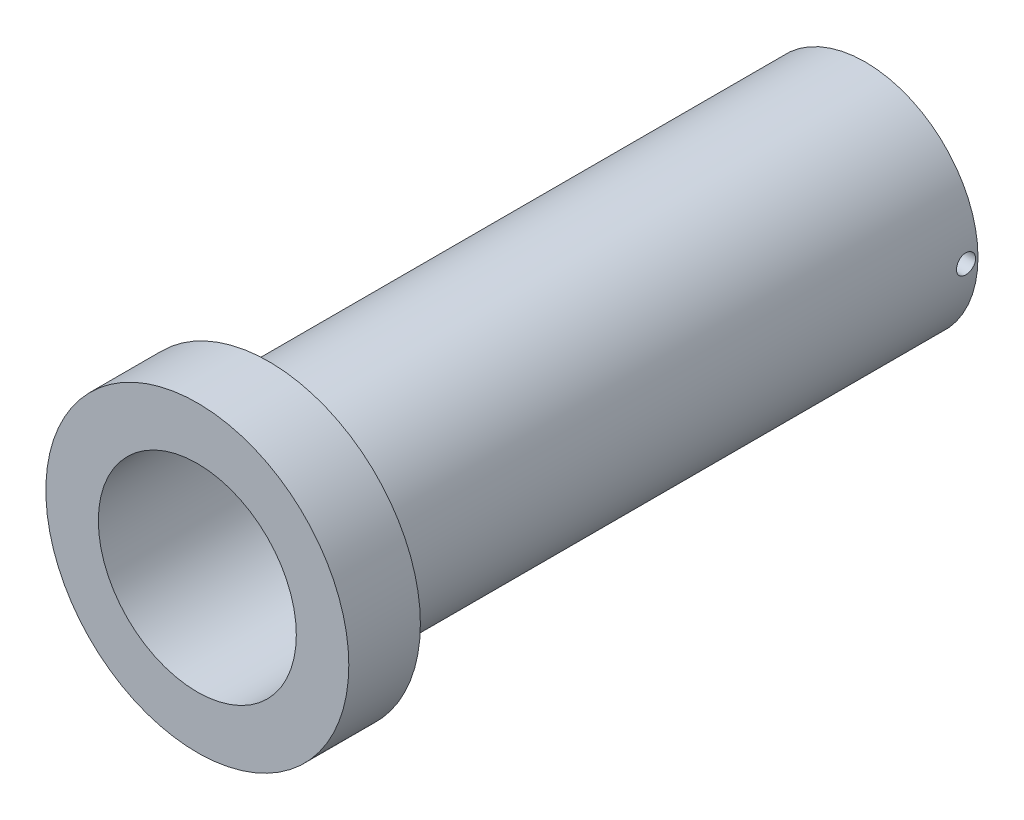
ISO-10303-21;
HEADER;
FILE_DESCRIPTION(('STEP AP214'),'2;1');
FILE_NAME('part.step','',(''),(''),'','','');
FILE_SCHEMA(('AUTOMOTIVE_DESIGN { 1 0 10303 214 1 1 1 1 }'));
ENDSEC;
DATA;
#1=APPLICATION_CONTEXT('core data for automotive mechanical design processes');
#2=APPLICATION_PROTOCOL_DEFINITION('international standard','automotive_design',2000,#1);
#3=PRODUCT_CONTEXT('',#1,'mechanical');
#4=PRODUCT('Part','Part','',(#3));
#5=PRODUCT_RELATED_PRODUCT_CATEGORY('part','',(#4));
#6=PRODUCT_DEFINITION_FORMATION('','',#4);
#7=PRODUCT_DEFINITION_CONTEXT('part definition',#1,'design');
#8=PRODUCT_DEFINITION('design','',#6,#7);
#9=PRODUCT_DEFINITION_SHAPE('','',#8);
#10=(LENGTH_UNIT() NAMED_UNIT(*) SI_UNIT(.MILLI.,.METRE.));
#11=(NAMED_UNIT(*) PLANE_ANGLE_UNIT() SI_UNIT($,.RADIAN.));
#12=(NAMED_UNIT(*) SI_UNIT($,.STERADIAN.) SOLID_ANGLE_UNIT());
#13=UNCERTAINTY_MEASURE_WITH_UNIT(LENGTH_MEASURE(1.E-05),#10,'distance_accuracy_value','');
#14=(GEOMETRIC_REPRESENTATION_CONTEXT(3) GLOBAL_UNCERTAINTY_ASSIGNED_CONTEXT((#13)) GLOBAL_UNIT_ASSIGNED_CONTEXT((#10,
#11,#12)) REPRESENTATION_CONTEXT('',''));
#15=CARTESIAN_POINT('',(0.,0.,0.));
#16=DIRECTION('',(0.,0.,1.));
#17=DIRECTION('',(1.,0.,0.));
#18=AXIS2_PLACEMENT_3D('',#15,#16,#17);
#19=CARTESIAN_POINT('',(12.7336330130561,-2.88366824144162,0.));
#20=DIRECTION('',(0.,0.,1.));
#21=DIRECTION('',(1.,0.,0.));
#22=AXIS2_PLACEMENT_3D('',#19,#20,#21);
#23=PLANE('',#22);
#24=CARTESIAN_POINT('',(12.7336330130561,-2.88366824144162,0.));
#25=DIRECTION('',(0.,0.,1.));
#26=DIRECTION('',(1.,0.,0.));
#27=AXIS2_PLACEMENT_3D('',#24,#25,#26);
#28=CIRCLE('',#27,9.44999999999997);
#29=CARTESIAN_POINT('',(22.183633013056,-2.88366824144162,0.));
#30=VERTEX_POINT('',#29);
#31=EDGE_CURVE('E44',#30,#30,#28,.T.);
#32=ORIENTED_EDGE('',*,*,#31,.F.);
#33=EDGE_LOOP('',(#32));
#34=FACE_BOUND('',#33,.T.);
#35=CARTESIAN_POINT('',(12.7336330130561,-2.88366824144162,0.));
#36=DIRECTION('',(0.,0.,1.));
#37=DIRECTION('',(1.,0.,0.));
#38=AXIS2_PLACEMENT_3D('',#35,#36,#37);
#39=CIRCLE('',#38,8.30000000000003);
#40=CARTESIAN_POINT('',(21.0336330130561,-2.88366824144162,0.));
#41=VERTEX_POINT('',#40);
#42=EDGE_CURVE('E49',#41,#41,#39,.T.);
#43=ORIENTED_EDGE('',*,*,#42,.T.);
#44=EDGE_LOOP('',(#43));
#45=FACE_BOUND('',#44,.T.);
#46=ADVANCED_FACE('F29',(#34,#45),#23,.F.);
#47=CARTESIAN_POINT('',(12.7336330130561,-2.88366824144162,50.));
#48=DIRECTION('',(0.,0.,-1.));
#49=DIRECTION('',(-1.,0.,0.));
#50=AXIS2_PLACEMENT_3D('',#47,#48,#49);
#51=CYLINDRICAL_SURFACE('',#50,9.44999999999997);
#52=CARTESIAN_POINT('',(22.183633013056,-2.88366824144162,0.200000000000006));
#53=CARTESIAN_POINT('',(22.1836325699085,-2.92851844962443,0.200001957801475));
#54=CARTESIAN_POINT('',(22.1833103178097,-2.97339912599602,0.203784327206218));
#55=CARTESIAN_POINT('',(22.1820557741542,-3.0619185387717,0.218817151966477));
#56=CARTESIAN_POINT('',(22.181122792868,-3.10555581271976,0.23007605117833));
#57=CARTESIAN_POINT('',(22.1787522139417,-3.19029358645616,0.259733861815818));
#58=CARTESIAN_POINT('',(22.1773149032723,-3.231395513288,0.2781287134086));
#59=CARTESIAN_POINT('',(22.1740968180508,-3.30991859274649,0.321528957448361));
#60=CARTESIAN_POINT('',(22.1723161166118,-3.34734052634161,0.346532943132449));
#61=CARTESIAN_POINT('',(22.1686058146366,-3.41754935927911,0.402512533698724));
#62=CARTESIAN_POINT('',(22.1666758770768,-3.45032526418135,0.433501906544288));
#63=CARTESIAN_POINT('',(22.1628874437386,-3.51021730680635,0.500543483109453));
#64=CARTESIAN_POINT('',(22.1610289511133,-3.53733319496399,0.536595909955322));
#65=CARTESIAN_POINT('',(22.1575902226143,-3.58517283887165,0.612806951253984));
#66=CARTESIAN_POINT('',(22.1560104099223,-3.60588690858072,0.652971666615765));
#67=CARTESIAN_POINT('',(22.1533117974249,-3.64027304773824,0.736224654270717));
#68=CARTESIAN_POINT('',(22.1521929892418,-3.65394524515722,0.779312873419533));
#69=CARTESIAN_POINT('',(22.1505459108842,-3.67382758944104,0.86707942856237));
#70=CARTESIAN_POINT('',(22.1500162212562,-3.68005567526194,0.911753673648385));
#71=CARTESIAN_POINT('',(22.1496028733042,-3.68492842490367,1.00151633733654));
#72=CARTESIAN_POINT('',(22.1497192025034,-3.68357323518237,1.046604747923));
#73=CARTESIAN_POINT('',(22.1505834581477,-3.67333272579041,1.13579286032383));
#74=CARTESIAN_POINT('',(22.1513297487613,-3.66446690888032,1.17989481949783));
#75=CARTESIAN_POINT('',(22.1533672734495,-3.63948711593012,1.26598243922107));
#76=CARTESIAN_POINT('',(22.1546585129957,-3.62337306711367,1.30796807851656));
#77=CARTESIAN_POINT('',(22.1576423271034,-3.58433241547091,1.38869335152905));
#78=CARTESIAN_POINT('',(22.1593354161534,-3.56139706972019,1.42742873717269));
#79=CARTESIAN_POINT('',(22.1629316876978,-3.50937117592772,1.50050748898719));
#80=CARTESIAN_POINT('',(22.1648348745848,-3.48028049918348,1.53485076329883));
#81=CARTESIAN_POINT('',(22.1686441771526,-3.41666036864909,1.59828380644911));
#82=CARTESIAN_POINT('',(22.1705502831477,-3.38211405569917,1.62735666967058));
#83=CARTESIAN_POINT('',(22.174144939178,-3.30862209302479,1.67929288438943));
#84=CARTESIAN_POINT('',(22.1758334890615,-3.26967644023576,1.70215623156123));
#85=CARTESIAN_POINT('',(22.1788031162952,-3.18848028111844,1.74102338239214));
#86=CARTESIAN_POINT('',(22.1800841486928,-3.14622941083737,1.75702642937107));
#87=CARTESIAN_POINT('',(22.1820938925707,-3.05962724261698,1.78170683536538));
#88=CARTESIAN_POINT('',(22.1828226158807,-3.01527598968668,1.79038435128431));
#89=CARTESIAN_POINT('',(22.1836441156687,-2.92587855125221,1.80014615826922));
#90=CARTESIAN_POINT('',(22.183738847683,-2.88083493259897,1.80125379872188));
#91=CARTESIAN_POINT('',(22.1832869154884,-2.79120264453761,1.79590559174734));
#92=CARTESIAN_POINT('',(22.1827402574566,-2.74661397075215,1.78944981716196));
#93=CARTESIAN_POINT('',(22.1810682769353,-2.65922391815007,1.76917738993147));
#94=CARTESIAN_POINT('',(22.1799438059762,-2.61642000918259,1.75537156806879));
#95=CARTESIAN_POINT('',(22.1772425067305,-2.53373613814882,1.72080201027857));
#96=CARTESIAN_POINT('',(22.1756656710709,-2.49385622375357,1.70003816094229));
#97=CARTESIAN_POINT('',(22.1722315031732,-2.41804617811511,1.65208333687067));
#98=CARTESIAN_POINT('',(22.1703735001946,-2.3821258567138,1.62487690289044));
#99=CARTESIAN_POINT('',(22.1665879694713,-2.31535368769285,1.56483151987368));
#100=CARTESIAN_POINT('',(22.1646604404804,-2.28450193097465,1.53199246984139));
#101=CARTESIAN_POINT('',(22.1609473067924,-2.22866249628207,1.46151267246784));
#102=CARTESIAN_POINT('',(22.1591620787866,-2.20369006161487,1.42385982562508));
#103=CARTESIAN_POINT('',(22.1559410420194,-2.16042268495072,1.34488144803985));
#104=CARTESIAN_POINT('',(22.1545052296736,-2.14212767445743,1.30355595497642));
#105=CARTESIAN_POINT('',(22.1521477246357,-2.11276040730965,1.21845921476857));
#106=CARTESIAN_POINT('',(22.1512253693192,-2.10167883845248,1.17469120041478));
#107=CARTESIAN_POINT('',(22.1499970054209,-2.08702270831297,1.08590760708831));
#108=CARTESIAN_POINT('',(22.1496909845813,-2.08344799773168,1.04089205294515));
#109=CARTESIAN_POINT('',(22.1497301234434,-2.08390880669528,0.951042695911032));
#110=CARTESIAN_POINT('',(22.1500732338139,-2.08792037605638,0.906208767350857));
#111=CARTESIAN_POINT('',(22.1513676197663,-2.10338991056084,0.817853868953378));
#112=CARTESIAN_POINT('',(22.1523188962605,-2.1148478868724,0.77433290108537));
#113=CARTESIAN_POINT('',(22.1547218880036,-2.14487887784745,0.689837893198046));
#114=CARTESIAN_POINT('',(22.1561735714494,-2.16345144035411,0.648863691515127));
#115=CARTESIAN_POINT('',(22.1594138616912,-2.2071817309347,0.570610934534407));
#116=CARTESIAN_POINT('',(22.1612024634482,-2.23233936052201,0.533332323976638));
#117=CARTESIAN_POINT('',(22.1649217792851,-2.28861565622407,0.463406364311239));
#118=CARTESIAN_POINT('',(22.1668529055902,-2.31975206685585,0.430773317896612));
#119=CARTESIAN_POINT('',(22.1706359154252,-2.38706960256585,0.37118313932058));
#120=CARTESIAN_POINT('',(22.1724877796827,-2.42325194554829,0.344227381404436));
#121=CARTESIAN_POINT('',(22.1759070551248,-2.49970612047938,0.296719602859213));
#122=CARTESIAN_POINT('',(22.1774739167848,-2.53998562408367,0.276179899731721));
#123=CARTESIAN_POINT('',(22.1801402408266,-2.62340757691586,0.242181642361555));
#124=CARTESIAN_POINT('',(22.1812402394506,-2.66654667535638,0.228714959752436));
#125=CARTESIAN_POINT('',(22.1825669471355,-2.73889431149369,0.21266948924291));
#126=CARTESIAN_POINT('',(22.1829648986949,-2.7676377658774,0.207924758453541));
#127=CARTESIAN_POINT('',(22.183498075077,-2.82547261792917,0.201589382948359));
#128=CARTESIAN_POINT('',(22.1836333006236,-2.85456401463832,0.19999872954218));
#129=CARTESIAN_POINT('',(22.183633013056,-2.88366824144162,0.200000000000006));
#130=B_SPLINE_CURVE_WITH_KNOTS('',3,(#52,#53,#54,#55,#56,#57,#58,#59,#60,#61,#62,#63,#64,#65,
#66,#67,#68,#69,#70,#71,#72,#73,#74,#75,#76,#77,#78,#79,#80,#81,#82,#83,#84,#85,#86,#87,#88,#89,
#90,#91,#92,#93,#94,#95,#96,#97,#98,#99,#100,#101,#102,#103,#104,#105,#106,#107,#108,#109,#110,
#111,#112,#113,#114,#115,#116,#117,#118,#119,#120,#121,#122,#123,#124,#125,#126,#127,#128,#129),
.UNSPECIFIED.,.T.,.F.,(4,2,2,2,2,2,2,2,2,2,2,2,2,2,2,2,2,2,2,2,2,2,2,2,2,2,2,2,2,2,2,2,2,2,2,2,
2,2,4),(0.,0.13444436117742,0.269040820189351,0.403560815738637,0.538052201554678,
0.672856718806852,0.807667178692346,0.942680621268849,1.07769161018653,1.21237658693537,
1.34705896248554,1.48139267805896,1.61572774244872,1.75023573293226,1.88474653613592,
2.01968144929279,2.15461645644575,2.28956634288803,2.4245133388023,2.55904390020354,
2.69357316597709,2.82790474042363,2.96223850444413,3.09689793378137,3.23155977788525,
3.36656700646649,3.50157285011846,3.63640406031115,3.77123258890976,3.90563616901959,
4.04003995070987,4.1744351919864,4.30882842335521,4.44362686605765,4.57845790068436,
4.71354621446331,4.84847894220299,4.93572290649763,5.02296663041042),.UNSPECIFIED.);
#131=CARTESIAN_POINT('',(22.183633013056,-2.88366824144162,0.200000000000006));
#132=VERTEX_POINT('',#131);
#133=EDGE_CURVE('E10',#132,#132,#130,.T.);
#134=ORIENTED_EDGE('',*,*,#133,.T.);
#135=EDGE_LOOP('',(#134));
#136=FACE_BOUND('',#135,.T.);
#137=CARTESIAN_POINT('',(3.28363301305611,-2.88366824144162,1.79999999999999));
#138=CARTESIAN_POINT('',(3.28363345620362,-2.92851844962443,1.79999804219853));
#139=CARTESIAN_POINT('',(3.28395570830242,-2.97339912599602,1.79621567279378));
#140=CARTESIAN_POINT('',(3.28521025195799,-3.06191853877169,1.78118284803352));
#141=CARTESIAN_POINT('',(3.28614323324417,-3.10555581271975,1.76992394882167));
#142=CARTESIAN_POINT('',(3.28851381217048,-3.19029358645616,1.74026613818418));
#143=CARTESIAN_POINT('',(3.2899511228399,-3.231395513288,1.7218712865914));
#144=CARTESIAN_POINT('',(3.29316920806131,-3.30991859274649,1.67847104255164));
#145=CARTESIAN_POINT('',(3.29494990950034,-3.34734052634161,1.65346705686755));
#146=CARTESIAN_POINT('',(3.29866021147559,-3.41754935927911,1.59748746630127));
#147=CARTESIAN_POINT('',(3.30059014903535,-3.45032526418135,1.56649809345571));
#148=CARTESIAN_POINT('',(3.30437858237357,-3.51021730680635,1.49945651689055));
#149=CARTESIAN_POINT('',(3.30623707499889,-3.53733319496399,1.46340409004468));
#150=CARTESIAN_POINT('',(3.30967580349784,-3.58517283887165,1.38719304874601));
#151=CARTESIAN_POINT('',(3.31125561618982,-3.60588690858072,1.34702833338423));
#152=CARTESIAN_POINT('',(3.31395422868723,-3.64027304773824,1.26377534572928));
#153=CARTESIAN_POINT('',(3.31507303687032,-3.65394524515722,1.22068712658047));
#154=CARTESIAN_POINT('',(3.31672011522791,-3.67382758944104,1.13292057143763));
#155=CARTESIAN_POINT('',(3.31724980485592,-3.68005567526194,1.08824632635161));
#156=CARTESIAN_POINT('',(3.31766315280798,-3.68492842490367,0.998483662663457));
#157=CARTESIAN_POINT('',(3.31754682360875,-3.68357323518237,0.953395252076997));
#158=CARTESIAN_POINT('',(3.31668256796444,-3.67333272579041,0.864207139676164));
#159=CARTESIAN_POINT('',(3.3159362773509,-3.66446690888032,0.820105180502169));
#160=CARTESIAN_POINT('',(3.3138987526627,-3.63948711593012,0.73401756077893));
#161=CARTESIAN_POINT('',(3.31260751311645,-3.62337306711368,0.692031921483438));
#162=CARTESIAN_POINT('',(3.30962369900879,-3.58433241547091,0.611306648470945));
#163=CARTESIAN_POINT('',(3.30793060995877,-3.56139706972019,0.572571262827305));
#164=CARTESIAN_POINT('',(3.30433433841435,-3.50937117592772,0.499492511012806));
#165=CARTESIAN_POINT('',(3.30243115152738,-3.48028049918348,0.465149236701171));
#166=CARTESIAN_POINT('',(3.29862184895956,-3.41666036864909,0.401716193550887));
#167=CARTESIAN_POINT('',(3.29671574296441,-3.38211405569917,0.372643330329419));
#168=CARTESIAN_POINT('',(3.29312108693418,-3.30862209302479,0.320707115610571));
#169=CARTESIAN_POINT('',(3.29143253705067,-3.26967644023576,0.29784376843877));
#170=CARTESIAN_POINT('',(3.288462909817,-3.18848028111844,0.258976617607861));
#171=CARTESIAN_POINT('',(3.28718187741939,-3.14622941083737,0.242973570628932));
#172=CARTESIAN_POINT('',(3.28517213354149,-3.05962724261698,0.218293164634616));
#173=CARTESIAN_POINT('',(3.28444341023148,-3.01527598968668,0.209615648715686));
#174=CARTESIAN_POINT('',(3.28362191044341,-2.92587855125221,0.199853841730782));
#175=CARTESIAN_POINT('',(3.28352717842911,-2.88083493259898,0.198746201278116));
#176=CARTESIAN_POINT('',(3.28397911062373,-2.79120264453761,0.204094408252652));
#177=CARTESIAN_POINT('',(3.28452576865554,-2.74661397075215,0.210550182838037));
#178=CARTESIAN_POINT('',(3.28619774917682,-2.65922391815008,0.230822610068526));
#179=CARTESIAN_POINT('',(3.28732222013594,-2.61642000918259,0.244628431931205));
#180=CARTESIAN_POINT('',(3.29002351938163,-2.53373613814882,0.279197989721423));
#181=CARTESIAN_POINT('',(3.29160035504123,-2.49385622375357,0.299961839057703));
#182=CARTESIAN_POINT('',(3.29503452293899,-2.41804617811511,0.347916663129326));
#183=CARTESIAN_POINT('',(3.29689252591753,-2.3821258567138,0.375123097109556));
#184=CARTESIAN_POINT('',(3.30067805664083,-2.31535368769285,0.435168480126315));
#185=CARTESIAN_POINT('',(3.30260558563174,-2.28450193097465,0.468007530158605));
#186=CARTESIAN_POINT('',(3.30631871931976,-2.22866249628207,0.538487327532161));
#187=CARTESIAN_POINT('',(3.30810394732552,-2.20369006161487,0.576140174374921));
#188=CARTESIAN_POINT('',(3.3113249840928,-2.16042268495072,0.655118551960149));
#189=CARTESIAN_POINT('',(3.31276079643855,-2.14212767445743,0.696444045023579));
#190=CARTESIAN_POINT('',(3.31511830147648,-2.11276040730965,0.781540785231425));
#191=CARTESIAN_POINT('',(3.31604065679297,-2.10167883845248,0.825308799585213));
#192=CARTESIAN_POINT('',(3.31726902069122,-2.08702270831297,0.914092392911691));
#193=CARTESIAN_POINT('',(3.31757504153084,-2.08344799773168,0.959107947054848));
#194=CARTESIAN_POINT('',(3.31753590266874,-2.08390880669528,1.04895730408896));
#195=CARTESIAN_POINT('',(3.3171927922983,-2.08792037605638,1.09379123264914));
#196=CARTESIAN_POINT('',(3.31589840634583,-2.10338991056084,1.18214613104662));
#197=CARTESIAN_POINT('',(3.31494712985168,-2.11484788687239,1.22566709891463));
#198=CARTESIAN_POINT('',(3.31254413810854,-2.14487887784745,1.31016210680195));
#199=CARTESIAN_POINT('',(3.31109245466276,-2.16345144035411,1.35113630848487));
#200=CARTESIAN_POINT('',(3.30785216442093,-2.2071817309347,1.42938906546559));
#201=CARTESIAN_POINT('',(3.30606356266395,-2.23233936052201,1.46666767602336));
#202=CARTESIAN_POINT('',(3.30234424682709,-2.28861565622407,1.53659363568876));
#203=CARTESIAN_POINT('',(3.30041312052196,-2.31975206685585,1.56922668210338));
#204=CARTESIAN_POINT('',(3.29663011068694,-2.38706960256585,1.62881686067942));
#205=CARTESIAN_POINT('',(3.29477824642947,-2.42325194554829,1.65577261859556));
#206=CARTESIAN_POINT('',(3.29135897098736,-2.49970612047938,1.70328039714078));
#207=CARTESIAN_POINT('',(3.28979210932739,-2.53998562408367,1.72382010026828));
#208=CARTESIAN_POINT('',(3.28712578528551,-2.62340757691586,1.75781835763844));
#209=CARTESIAN_POINT('',(3.28602578666157,-2.66654667535638,1.77128504024756));
#210=CARTESIAN_POINT('',(3.28469907897669,-2.73889431149369,1.78733051075709));
#211=CARTESIAN_POINT('',(3.28430112741727,-2.7676377658774,1.79207524154646));
#212=CARTESIAN_POINT('',(3.28376795103513,-2.82547261792917,1.79841061705164));
#213=CARTESIAN_POINT('',(3.28363272548853,-2.85456401463832,1.80000127045782));
#214=CARTESIAN_POINT('',(3.28363301305611,-2.88366824144162,1.79999999999999));
#215=B_SPLINE_CURVE_WITH_KNOTS('',3,(#137,#138,#139,#140,#141,#142,#143,#144,#145,#146,#147,
#148,#149,#150,#151,#152,#153,#154,#155,#156,#157,#158,#159,#160,#161,#162,#163,#164,#165,#166,
#167,#168,#169,#170,#171,#172,#173,#174,#175,#176,#177,#178,#179,#180,#181,#182,#183,#184,#185,
#186,#187,#188,#189,#190,#191,#192,#193,#194,#195,#196,#197,#198,#199,#200,#201,#202,#203,#204,
#205,#206,#207,#208,#209,#210,#211,#212,#213,#214),.UNSPECIFIED.,.T.,.F.,(4,2,2,2,2,2,2,2,2,2,2,
2,2,2,2,2,2,2,2,2,2,2,2,2,2,2,2,2,2,2,2,2,2,2,2,2,2,2,4),(0.,0.13444436117742,0.269040820189351,
0.403560815738637,0.538052201554678,0.672856718806852,0.807667178692346,0.942680621268848,
1.07769161018653,1.21237658693537,1.34705896248554,1.48139267805896,1.61572774244872,
1.75023573293226,1.88474653613592,2.01968144929279,2.15461645644575,2.28956634288803,
2.4245133388023,2.55904390020354,2.69357316597709,2.82790474042363,2.96223850444413,
3.09689793378136,3.23155977788525,3.36656700646649,3.50157285011845,3.63640406031115,
3.77123258890976,3.90563616901959,4.04003995070986,4.1744351919864,4.3088284233552,
4.44362686605765,4.57845790068436,4.71354621446331,4.84847894220299,4.93572290649763,
5.02296663041042),.UNSPECIFIED.);
#216=CARTESIAN_POINT('',(3.28363301305611,-2.88366824144162,1.79999999999999));
#217=VERTEX_POINT('',#216);
#218=EDGE_CURVE('E53',#217,#217,#215,.T.);
#219=ORIENTED_EDGE('',*,*,#218,.T.);
#220=EDGE_LOOP('',(#219));
#221=FACE_BOUND('',#220,.T.);
#222=CARTESIAN_POINT('',(12.7336330130561,-2.88366824144162,50.));
#223=DIRECTION('',(0.,0.,1.));
#224=DIRECTION('',(1.,0.,0.));
#225=AXIS2_PLACEMENT_3D('',#222,#223,#224);
#226=CIRCLE('',#225,9.44999999999997);
#227=CARTESIAN_POINT('',(22.183633013056,-2.88366824144162,50.));
#228=VERTEX_POINT('',#227);
#229=EDGE_CURVE('E40',#228,#228,#226,.T.);
#230=ORIENTED_EDGE('',*,*,#229,.F.);
#231=EDGE_LOOP('',(#230));
#232=FACE_BOUND('',#231,.T.);
#233=ORIENTED_EDGE('',*,*,#31,.T.);
#234=EDGE_LOOP('',(#233));
#235=FACE_BOUND('',#234,.T.);
#236=ADVANCED_FACE('F31',(#136,#221,#232,#235),#51,.T.);
#237=CARTESIAN_POINT('',(12.7336330130561,-2.88366824144162,50.));
#238=DIRECTION('',(0.,0.,-1.));
#239=DIRECTION('',(-1.,0.,0.));
#240=AXIS2_PLACEMENT_3D('',#237,#238,#239);
#241=CYLINDRICAL_SURFACE('',#240,8.30000000000003);
#242=CARTESIAN_POINT('',(4.43363301305604,-2.88366824144162,1.79999999999999));
#243=CARTESIAN_POINT('',(4.43363351212568,-2.92849301665108,1.79999805482184));
#244=CARTESIAN_POINT('',(4.4339999938005,-2.97334763200914,1.79621995533165));
#245=CARTESIAN_POINT('',(4.43542672247007,-3.0618139002781,1.78120508251486));
#246=CARTESIAN_POINT('',(4.43648773881096,-3.10542411878129,1.76996003774524));
#247=CARTESIAN_POINT('',(4.43918373683666,-3.19010766248056,1.7403411667892));
#248=CARTESIAN_POINT('',(4.44081837688587,-3.23118248061158,1.72197158311199));
#249=CARTESIAN_POINT('',(4.44447871700222,-3.30965663956669,1.67863316842202));
#250=CARTESIAN_POINT('',(4.44650433792095,-3.34705672197943,1.65366567268429));
#251=CARTESIAN_POINT('',(4.4507272410501,-3.41725440667864,1.59775015461261));
#252=CARTESIAN_POINT('',(4.4529250170454,-3.4500379547176,1.56678452389852));
#253=CARTESIAN_POINT('',(4.45724043045787,-3.50995121533446,1.49978922779321));
#254=CARTESIAN_POINT('',(4.45935806420907,-3.53708066953049,1.46375933110011));
#255=CARTESIAN_POINT('',(4.46327852663648,-3.58496495579374,1.38757089085599));
#256=CARTESIAN_POINT('',(4.4650807280245,-3.60570714655441,1.34740436722283));
#257=CARTESIAN_POINT('',(4.46816024741772,-3.64014738703208,1.2641382508749));
#258=CARTESIAN_POINT('',(4.4694375775278,-3.65384559920306,1.22103872582937));
#259=CARTESIAN_POINT('',(4.47131833051446,-3.67376756160958,1.13327287175198));
#260=CARTESIAN_POINT('',(4.47192384710726,-3.6800145383195,1.08861186051069));
#261=CARTESIAN_POINT('',(4.47239893831494,-3.6849284883693,0.99887145900787));
#262=CARTESIAN_POINT('',(4.47226853098614,-3.68359564768442,0.95379207903836));
#263=CARTESIAN_POINT('',(4.4712884187985,-3.67340695290037,0.864654467472648));
#264=CARTESIAN_POINT('',(4.47044113610523,-3.66457643147693,0.820593309904223));
#265=CARTESIAN_POINT('',(4.468126527438,-3.63968244443224,0.734581378521348));
#266=CARTESIAN_POINT('',(4.4666591936241,-3.62361888735618,0.692630631398477));
#267=CARTESIAN_POINT('',(4.46326702631955,-3.58468675896853,0.611950159999642));
#268=CARTESIAN_POINT('',(4.46134143631629,-3.56180691909224,0.573225906436295));
#269=CARTESIAN_POINT('',(4.45725037459035,-3.50989980288444,0.500157517317867));
#270=CARTESIAN_POINT('',(4.45508489634892,-3.48087235947746,0.465813500846597));
#271=CARTESIAN_POINT('',(4.45074726303072,-3.4173523915354,0.402333258633007));
#272=CARTESIAN_POINT('',(4.44857511690495,-3.38283798386482,0.373218924618664));
#273=CARTESIAN_POINT('',(4.44447728051247,-3.30939989446592,0.321194077629256));
#274=CARTESIAN_POINT('',(4.4425515904932,-3.27047620831062,0.298283570883015));
#275=CARTESIAN_POINT('',(4.4391630714897,-3.18930951261363,0.259317714210965));
#276=CARTESIAN_POINT('',(4.43770031529871,-3.14706598235099,0.243263442243718));
#277=CARTESIAN_POINT('',(4.43540323880127,-3.06046574448658,0.218481654560086));
#278=CARTESIAN_POINT('',(4.43456890103911,-3.01610909561775,0.20975393533168));
#279=CARTESIAN_POINT('',(4.43362491037643,-2.92673136569564,0.199900697900469));
#280=CARTESIAN_POINT('',(4.43351237717855,-2.88171364485022,0.198744963962384));
#281=CARTESIAN_POINT('',(4.43401695887578,-2.79212513347931,0.20398919115012));
#282=CARTESIAN_POINT('',(4.43463406462452,-2.74755433735847,0.210389057562836));
#283=CARTESIAN_POINT('',(4.43652671959942,-2.66021184278274,0.230537754792646));
#284=CARTESIAN_POINT('',(4.43780100403477,-2.61743685854355,0.244272470925272));
#285=CARTESIAN_POINT('',(4.44086501520809,-2.53479815905396,0.278686504794132));
#286=CARTESIAN_POINT('',(4.44265475272199,-2.49493450468899,0.299365967717093));
#287=CARTESIAN_POINT('',(4.44655655241994,-2.41911322539309,0.347157647596964));
#288=CARTESIAN_POINT('',(4.44866960390252,-2.3831681895784,0.3742897550723));
#289=CARTESIAN_POINT('',(4.45297764949033,-2.31633184600307,0.434187974125337));
#290=CARTESIAN_POINT('',(4.4551726455032,-2.28544065598344,0.466954216926782));
#291=CARTESIAN_POINT('',(4.45940582474303,-2.22948427224356,0.537322267411899));
#292=CARTESIAN_POINT('',(4.46144345969656,-2.20443888309469,0.574939861223041));
#293=CARTESIAN_POINT('',(4.46512299496328,-2.1610211112151,0.653864760946543));
#294=CARTESIAN_POINT('',(4.46676490035413,-2.14264864286173,0.695172019507014));
#295=CARTESIAN_POINT('',(4.46946372589681,-2.11313152950994,0.780235256738855));
#296=CARTESIAN_POINT('',(4.47052160571649,-2.10197502207321,0.823987087414381));
#297=CARTESIAN_POINT('',(4.47193563448839,-2.08716800216785,0.912753711216702));
#298=CARTESIAN_POINT('',(4.47229180201228,-2.08351729104921,0.957768470886584));
#299=CARTESIAN_POINT('',(4.47226171551363,-2.08382814197537,1.04758631415773));
#300=CARTESIAN_POINT('',(4.47187849579235,-2.08775859238979,1.09238950970664));
#301=CARTESIAN_POINT('',(4.47041927847616,-2.10305504618833,1.18069604718763));
#302=CARTESIAN_POINT('',(4.46934328003072,-2.11442105870103,1.22419938752383));
#303=CARTESIAN_POINT('',(4.46662057468386,-2.14425757088229,1.30867159281217));
#304=CARTESIAN_POINT('',(4.46497393477035,-2.16272723667706,1.34964075458794));
#305=CARTESIAN_POINT('',(4.46129534771372,-2.20624351062168,1.42790234360184));
#306=CARTESIAN_POINT('',(4.45926340362607,-2.2312900666173,1.46519479999275));
#307=CARTESIAN_POINT('',(4.45503318057235,-2.28736605291249,1.53520381142812));
#308=CARTESIAN_POINT('',(4.45283427836779,-2.31841864468489,1.56790177722638));
#309=CARTESIAN_POINT('',(4.44852359998408,-2.38558005609726,1.62763691354698));
#310=CARTESIAN_POINT('',(4.44641184484854,-2.42169008782688,1.65467272316313));
#311=CARTESIAN_POINT('',(4.44250828145556,-2.49803373028697,1.7023655170691));
#312=CARTESIAN_POINT('',(4.44071724103006,-2.53827688347524,1.72300727711662));
#313=CARTESIAN_POINT('',(4.43766538131117,-2.62164916747456,1.7572131708945));
#314=CARTESIAN_POINT('',(4.43640396179411,-2.66477496672806,1.7707853208937));
#315=CARTESIAN_POINT('',(4.43487202659721,-2.73740082160518,1.78706564831033));
#316=CARTESIAN_POINT('',(4.43440955116018,-2.76643593862405,1.79190944508849));
#317=CARTESIAN_POINT('',(4.43378988125515,-2.82486583730019,1.79837725294614));
#318=CARTESIAN_POINT('',(4.43363268563773,-2.85426061760287,1.80000127614844));
#319=CARTESIAN_POINT('',(4.43363301305604,-2.88366824144162,1.79999999999999));
#320=B_SPLINE_CURVE_WITH_KNOTS('',3,(#242,#243,#244,#245,#246,#247,#248,#249,#250,#251,#252,
#253,#254,#255,#256,#257,#258,#259,#260,#261,#262,#263,#264,#265,#266,#267,#268,#269,#270,#271,
#272,#273,#274,#275,#276,#277,#278,#279,#280,#281,#282,#283,#284,#285,#286,#287,#288,#289,#290,
#291,#292,#293,#294,#295,#296,#297,#298,#299,#300,#301,#302,#303,#304,#305,#306,#307,#308,#309,
#310,#311,#312,#313,#314,#315,#316,#317,#318,#319),.UNSPECIFIED.,.T.,.F.,(4,2,2,2,2,2,2,2,2,2,2,
2,2,2,2,2,2,2,2,2,2,2,2,2,2,2,2,2,2,2,2,2,2,2,2,2,2,2,4),(0.,0.134366943658286,
0.268882979978426,0.40331903758152,0.537727909036144,0.67253750636001,0.807353262888989,
0.942434149147616,1.07751191992087,1.21216752599843,1.3468198282367,1.48101897821859,
1.61521982506802,1.74964377340554,1.88407137549632,2.01904921149236,2.1540271830096,
2.28902636837775,2.42402180370589,2.55847821477428,2.69293294038441,2.82712985791751,
2.96132958114312,3.0959484679488,3.23057049056624,3.36564217604596,3.50071212831107,
3.6355594686492,3.77040324004265,3.90469481568804,4.03898655620224,4.1732625374729,
4.30753745397723,4.44234089751485,4.57717670413603,4.7123311301792,4.84733196844044,
4.93548472313084,5.02363714591495),.UNSPECIFIED.);
#321=CARTESIAN_POINT('',(4.43363301305604,-2.88366824144162,1.79999999999999));
#322=VERTEX_POINT('',#321);
#323=EDGE_CURVE('E76',#322,#322,#320,.T.);
#324=ORIENTED_EDGE('',*,*,#323,.F.);
#325=EDGE_LOOP('',(#324));
#326=FACE_BOUND('',#325,.T.);
#327=CARTESIAN_POINT('',(21.0336330130561,-2.88366824144161,0.200000000000006));
#328=CARTESIAN_POINT('',(21.0336325139865,-2.92849301665106,0.200001945178158));
#329=CARTESIAN_POINT('',(21.0332660323117,-2.97334763200913,0.203780044668346));
#330=CARTESIAN_POINT('',(21.0318393036421,-3.06181390027809,0.218794917485139));
#331=CARTESIAN_POINT('',(21.0307782873012,-3.10542411878128,0.230039962254752));
#332=CARTESIAN_POINT('',(21.0280822892755,-3.19010766248055,0.259658833210794));
#333=CARTESIAN_POINT('',(21.0264476492263,-3.23118248061157,0.278028416888008));
#334=CARTESIAN_POINT('',(21.0227873091099,-3.30965663956668,0.321366831577968));
#335=CARTESIAN_POINT('',(21.0207616881912,-3.34705672197943,0.346334327315706));
#336=CARTESIAN_POINT('',(21.0165387850621,-3.41725440667864,0.402249845387379));
#337=CARTESIAN_POINT('',(21.0143410090668,-3.45003795471759,0.433215476101468));
#338=CARTESIAN_POINT('',(21.0100255956543,-3.50995121533446,0.500210772206775));
#339=CARTESIAN_POINT('',(21.0079079619031,-3.53708066953048,0.53624066889988));
#340=CARTESIAN_POINT('',(21.0039874994757,-3.58496495579374,0.612429109143994));
#341=CARTESIAN_POINT('',(21.0021852980877,-3.60570714655441,0.652595632777159));
#342=CARTESIAN_POINT('',(20.9991057786944,-3.64014738703208,0.735861749125088));
#343=CARTESIAN_POINT('',(20.9978284485844,-3.65384559920306,0.778961274170619));
#344=CARTESIAN_POINT('',(20.9959476955977,-3.67376756160957,0.866727128248004));
#345=CARTESIAN_POINT('',(20.9953421790049,-3.68001453831949,0.911388139489298));
#346=CARTESIAN_POINT('',(20.9948670877972,-3.6849284883693,1.00112854099212));
#347=CARTESIAN_POINT('',(20.994997495126,-3.68359564768442,1.04620792096163));
#348=CARTESIAN_POINT('',(20.9959776073137,-3.67340695290037,1.13534553252734));
#349=CARTESIAN_POINT('',(20.9968248900069,-3.66457643147693,1.17940669009576));
#350=CARTESIAN_POINT('',(20.9991394986742,-3.63968244443224,1.26541862147864));
#351=CARTESIAN_POINT('',(21.0006068324881,-3.62361888735618,1.30736936860151));
#352=CARTESIAN_POINT('',(21.0039989997926,-3.58468675896854,1.38804984000035));
#353=CARTESIAN_POINT('',(21.0059245897959,-3.56180691909224,1.42677409356369));
#354=CARTESIAN_POINT('',(21.0100156515218,-3.50989980288444,1.49984248268212));
#355=CARTESIAN_POINT('',(21.0121811297632,-3.48087235947747,1.53418649915339));
#356=CARTESIAN_POINT('',(21.0165187630814,-3.41735239153541,1.59766674136698));
#357=CARTESIAN_POINT('',(21.0186909092072,-3.38283798386482,1.62678107538133));
#358=CARTESIAN_POINT('',(21.0227887455997,-3.30939989446593,1.67880592237074));
#359=CARTESIAN_POINT('',(21.024714435619,-3.27047620831063,1.70171642911698));
#360=CARTESIAN_POINT('',(21.0281029546225,-3.18930951261364,1.74068228578903));
#361=CARTESIAN_POINT('',(21.0295657108134,-3.147065982351,1.75673655775628));
#362=CARTESIAN_POINT('',(21.0318627873109,-3.06046574448659,1.78151834543991));
#363=CARTESIAN_POINT('',(21.032697125073,-3.01610909561776,1.79024606466832));
#364=CARTESIAN_POINT('',(21.0336411157357,-2.92673136569565,1.80009930209953));
#365=CARTESIAN_POINT('',(21.0337536489336,-2.88171364485023,1.80125503603761));
#366=CARTESIAN_POINT('',(21.0332490672364,-2.79212513347932,1.79601080884988));
#367=CARTESIAN_POINT('',(21.0326319614876,-2.74755433735848,1.78961094243716));
#368=CARTESIAN_POINT('',(21.0307393065127,-2.66021184278275,1.76946224520735));
#369=CARTESIAN_POINT('',(21.0294650220774,-2.61743685854356,1.75572752907473));
#370=CARTESIAN_POINT('',(21.0264010109041,-2.53479815905397,1.72131349520587));
#371=CARTESIAN_POINT('',(21.0246112733902,-2.494934504689,1.70063403228291));
#372=CARTESIAN_POINT('',(21.0207094736922,-2.4191132253931,1.65284235240304));
#373=CARTESIAN_POINT('',(21.0185964222096,-2.38316818957841,1.6257102449277));
#374=CARTESIAN_POINT('',(21.0142883766218,-2.31633184600308,1.56581202587467));
#375=CARTESIAN_POINT('',(21.012093380609,-2.28544065598345,1.53304578307322));
#376=CARTESIAN_POINT('',(21.0078602013691,-2.22948427224357,1.46267773258811));
#377=CARTESIAN_POINT('',(21.0058225664156,-2.2044388830947,1.42506013877697));
#378=CARTESIAN_POINT('',(21.0021430311489,-2.16102111121511,1.34613523905347));
#379=CARTESIAN_POINT('',(21.000501125758,-2.14264864286174,1.30482798049299));
#380=CARTESIAN_POINT('',(20.9978023002153,-2.11313152950994,1.21976474326115));
#381=CARTESIAN_POINT('',(20.9967444203957,-2.10197502207321,1.17601291258563));
#382=CARTESIAN_POINT('',(20.9953303916238,-2.08716800216786,1.08724628878331));
#383=CARTESIAN_POINT('',(20.9949742240999,-2.08351729104921,1.04223152911343));
#384=CARTESIAN_POINT('',(20.9950043105985,-2.08382814197537,0.952413685842279));
#385=CARTESIAN_POINT('',(20.9953875303198,-2.08775859238978,0.907610490293373));
#386=CARTESIAN_POINT('',(20.996846747636,-2.10305504618833,0.81930395281238));
#387=CARTESIAN_POINT('',(20.9979227460814,-2.11442105870103,0.77580061247618));
#388=CARTESIAN_POINT('',(21.0006454514283,-2.14425757088229,0.691328407187839));
#389=CARTESIAN_POINT('',(21.0022920913418,-2.16272723667705,0.650359245412069));
#390=CARTESIAN_POINT('',(21.0059706783984,-2.20624351062168,0.572097656398164));
#391=CARTESIAN_POINT('',(21.0080026224861,-2.23129006661729,0.534805200007255));
#392=CARTESIAN_POINT('',(21.0122328455398,-2.28736605291248,0.464796188571888));
#393=CARTESIAN_POINT('',(21.0144317477444,-2.31841864468488,0.432098222773627));
#394=CARTESIAN_POINT('',(21.0187424261281,-2.38558005609725,0.372363086453027));
#395=CARTESIAN_POINT('',(21.0208541812636,-2.42169008782687,0.345327276836879));
#396=CARTESIAN_POINT('',(21.0247577446566,-2.49803373028696,0.297634482930904));
#397=CARTESIAN_POINT('',(21.0265487850821,-2.53827688347523,0.276992722883382));
#398=CARTESIAN_POINT('',(21.029600644801,-2.62164916747455,0.242786829105498));
#399=CARTESIAN_POINT('',(21.030862064318,-2.66477496672805,0.229214679106301));
#400=CARTESIAN_POINT('',(21.0323939995149,-2.73740082160517,0.212934351689674));
#401=CARTESIAN_POINT('',(21.032856474952,-2.76643593862404,0.208090554911505));
#402=CARTESIAN_POINT('',(21.033476144857,-2.82486583730018,0.201622747053863));
#403=CARTESIAN_POINT('',(21.0336333404744,-2.85426061760285,0.199998723851557));
#404=CARTESIAN_POINT('',(21.0336330130561,-2.88366824144161,0.200000000000006));
#405=B_SPLINE_CURVE_WITH_KNOTS('',3,(#327,#328,#329,#330,#331,#332,#333,#334,#335,#336,#337,
#338,#339,#340,#341,#342,#343,#344,#345,#346,#347,#348,#349,#350,#351,#352,#353,#354,#355,#356,
#357,#358,#359,#360,#361,#362,#363,#364,#365,#366,#367,#368,#369,#370,#371,#372,#373,#374,#375,
#376,#377,#378,#379,#380,#381,#382,#383,#384,#385,#386,#387,#388,#389,#390,#391,#392,#393,#394,
#395,#396,#397,#398,#399,#400,#401,#402,#403,#404),.UNSPECIFIED.,.T.,.F.,(4,2,2,2,2,2,2,2,2,2,2,
2,2,2,2,2,2,2,2,2,2,2,2,2,2,2,2,2,2,2,2,2,2,2,2,2,2,2,4),(0.,0.134366943658286,
0.268882979978425,0.40331903758152,0.537727909036144,0.67253750636001,0.807353262888989,
0.942434149147616,1.07751191992087,1.21216752599843,1.34681982823669,1.48101897821859,
1.61521982506802,1.74964377340554,1.88407137549632,2.01904921149236,2.1540271830096,
2.28902636837775,2.42402180370589,2.55847821477428,2.69293294038441,2.82712985791751,
2.96132958114312,3.0959484679488,3.23057049056624,3.36564217604596,3.50071212831107,
3.6355594686492,3.77040324004265,3.90469481568804,4.03898655620224,4.1732625374729,
4.30753745397723,4.44234089751485,4.57717670413603,4.7123311301792,4.84733196844044,
4.93548472313084,5.02363714591495),.UNSPECIFIED.);
#406=CARTESIAN_POINT('',(21.0336330130561,-2.88366824144161,0.200000000000006));
#407=VERTEX_POINT('',#406);
#408=EDGE_CURVE('E57',#407,#407,#405,.T.);
#409=ORIENTED_EDGE('',*,*,#408,.F.);
#410=EDGE_LOOP('',(#409));
#411=FACE_BOUND('',#410,.T.);
#412=ORIENTED_EDGE('',*,*,#42,.F.);
#413=EDGE_LOOP('',(#412));
#414=FACE_BOUND('',#413,.T.);
#415=CARTESIAN_POINT('',(12.7336330130561,-2.88366824144162,56.));
#416=DIRECTION('',(0.,0.,1.));
#417=DIRECTION('',(1.,0.,0.));
#418=AXIS2_PLACEMENT_3D('',#415,#416,#417);
#419=CIRCLE('',#418,8.30000000000003);
#420=CARTESIAN_POINT('',(21.0336330130561,-2.88366824144162,56.));
#421=VERTEX_POINT('',#420);
#422=EDGE_CURVE('E104',#421,#421,#419,.T.);
#423=ORIENTED_EDGE('',*,*,#422,.T.);
#424=EDGE_LOOP('',(#423));
#425=FACE_BOUND('',#424,.T.);
#426=ADVANCED_FACE('F80',(#326,#411,#414,#425),#241,.F.);
#427=CARTESIAN_POINT('',(12.7336330130561,-2.88366824144162,50.));
#428=DIRECTION('',(0.,0.,1.));
#429=DIRECTION('',(1.,0.,0.));
#430=AXIS2_PLACEMENT_3D('',#427,#428,#429);
#431=PLANE('',#430);
#432=CARTESIAN_POINT('',(12.7336330130561,-2.88366824144162,50.));
#433=DIRECTION('',(0.,0.,1.));
#434=DIRECTION('',(1.,0.,0.));
#435=AXIS2_PLACEMENT_3D('',#432,#433,#434);
#436=CIRCLE('',#435,12.7);
#437=CARTESIAN_POINT('',(25.4336330130561,-2.88366824144162,50.));
#438=VERTEX_POINT('',#437);
#439=EDGE_CURVE('E99',#438,#438,#436,.T.);
#440=ORIENTED_EDGE('',*,*,#439,.F.);
#441=EDGE_LOOP('',(#440));
#442=FACE_BOUND('',#441,.T.);
#443=ORIENTED_EDGE('',*,*,#229,.T.);
#444=EDGE_LOOP('',(#443));
#445=FACE_BOUND('',#444,.T.);
#446=ADVANCED_FACE('F84',(#442,#445),#431,.F.);
#447=CARTESIAN_POINT('',(12.7336330130561,-2.88366824144162,56.));
#448=DIRECTION('',(0.,0.,1.));
#449=DIRECTION('',(1.,0.,0.));
#450=AXIS2_PLACEMENT_3D('',#447,#448,#449);
#451=PLANE('',#450);
#452=CARTESIAN_POINT('',(12.7336330130561,-2.88366824144162,56.));
#453=DIRECTION('',(0.,0.,1.));
#454=DIRECTION('',(1.,0.,0.));
#455=AXIS2_PLACEMENT_3D('',#452,#453,#454);
#456=CIRCLE('',#455,12.7);
#457=CARTESIAN_POINT('',(25.4336330130561,-2.88366824144162,56.));
#458=VERTEX_POINT('',#457);
#459=EDGE_CURVE('E97',#458,#458,#456,.T.);
#460=ORIENTED_EDGE('',*,*,#459,.T.);
#461=EDGE_LOOP('',(#460));
#462=FACE_BOUND('',#461,.T.);
#463=ORIENTED_EDGE('',*,*,#422,.F.);
#464=EDGE_LOOP('',(#463));
#465=FACE_BOUND('',#464,.T.);
#466=ADVANCED_FACE('F65',(#462,#465),#451,.T.);
#467=CARTESIAN_POINT('',(12.7336330130561,-2.88366824144162,56.));
#468=DIRECTION('',(0.,0.,-1.));
#469=DIRECTION('',(-1.,0.,0.));
#470=AXIS2_PLACEMENT_3D('',#467,#468,#469);
#471=CYLINDRICAL_SURFACE('',#470,12.7);
#472=ORIENTED_EDGE('',*,*,#459,.F.);
#473=EDGE_LOOP('',(#472));
#474=FACE_BOUND('',#473,.T.);
#475=ORIENTED_EDGE('',*,*,#439,.T.);
#476=EDGE_LOOP('',(#475));
#477=FACE_BOUND('',#476,.T.);
#478=ADVANCED_FACE('F63',(#474,#477),#471,.T.);
#479=CARTESIAN_POINT('',(22.183633013056,-2.88366824144161,0.999999999999999));
#480=DIRECTION('',(1.,0.,0.));
#481=DIRECTION('',(0.,0.,-1.));
#482=AXIS2_PLACEMENT_3D('',#479,#480,#481);
#483=CYLINDRICAL_SURFACE('',#482,0.799999999999993);
#484=ORIENTED_EDGE('',*,*,#323,.T.);
#485=EDGE_LOOP('',(#484));
#486=FACE_BOUND('',#485,.T.);
#487=ORIENTED_EDGE('',*,*,#218,.F.);
#488=EDGE_LOOP('',(#487));
#489=FACE_BOUND('',#488,.T.);
#490=ADVANCED_FACE('F58',(#486,#489),#483,.F.);
#491=ORIENTED_EDGE('',*,*,#408,.T.);
#492=EDGE_LOOP('',(#491));
#493=FACE_BOUND('',#492,.T.);
#494=ORIENTED_EDGE('',*,*,#133,.F.);
#495=EDGE_LOOP('',(#494));
#496=FACE_BOUND('',#495,.T.);
#497=ADVANCED_FACE('F62',(#493,#496),#483,.F.);
#498=CLOSED_SHELL('',(#46,#236,#426,#446,#466,#478,#490,#497));
#499=MANIFOLD_SOLID_BREP('B2',#498);
#500=ADVANCED_BREP_SHAPE_REPRESENTATION('',(#18,#499),#14);
#501=SHAPE_DEFINITION_REPRESENTATION(#9,#500);
ENDSEC;
END-ISO-10303-21;
